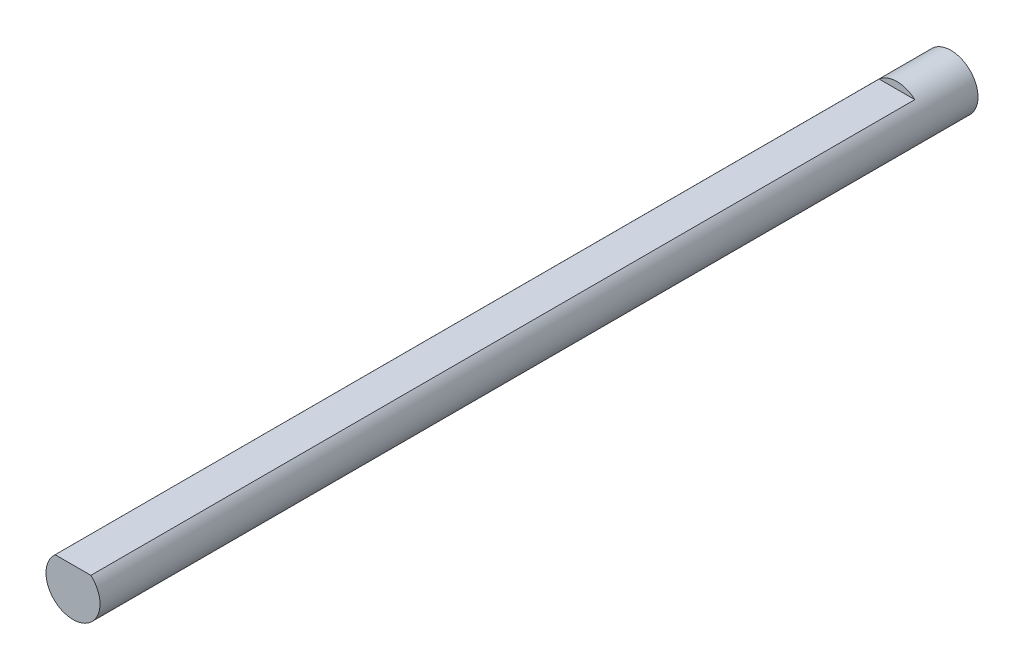
ISO-10303-21;
HEADER;
FILE_DESCRIPTION(('STEP AP214'),'2;1');
FILE_NAME('part.step','',(''),(''),'','','');
FILE_SCHEMA(('AUTOMOTIVE_DESIGN { 1 0 10303 214 1 1 1 1 }'));
ENDSEC;
DATA;
#1=APPLICATION_CONTEXT('core data for automotive mechanical design processes');
#2=APPLICATION_PROTOCOL_DEFINITION('international standard','automotive_design',2000,#1);
#3=PRODUCT_CONTEXT('',#1,'mechanical');
#4=PRODUCT('Part','Part','',(#3));
#5=PRODUCT_RELATED_PRODUCT_CATEGORY('part','',(#4));
#6=PRODUCT_DEFINITION_FORMATION('','',#4);
#7=PRODUCT_DEFINITION_CONTEXT('part definition',#1,'design');
#8=PRODUCT_DEFINITION('design','',#6,#7);
#9=PRODUCT_DEFINITION_SHAPE('','',#8);
#10=(LENGTH_UNIT() NAMED_UNIT(*) SI_UNIT(.MILLI.,.METRE.));
#11=(NAMED_UNIT(*) PLANE_ANGLE_UNIT() SI_UNIT($,.RADIAN.));
#12=(NAMED_UNIT(*) SI_UNIT($,.STERADIAN.) SOLID_ANGLE_UNIT());
#13=UNCERTAINTY_MEASURE_WITH_UNIT(LENGTH_MEASURE(1.E-05),#10,'distance_accuracy_value','');
#14=(GEOMETRIC_REPRESENTATION_CONTEXT(3) GLOBAL_UNCERTAINTY_ASSIGNED_CONTEXT((#13)) GLOBAL_UNIT_ASSIGNED_CONTEXT((#10,
#11,#12)) REPRESENTATION_CONTEXT('',''));
#15=CARTESIAN_POINT('',(0.,0.,0.));
#16=DIRECTION('',(0.,0.,1.));
#17=DIRECTION('',(1.,0.,0.));
#18=AXIS2_PLACEMENT_3D('',#15,#16,#17);
#19=CARTESIAN_POINT('',(0.,0.,-65.));
#20=DIRECTION('',(0.,0.,1.));
#21=DIRECTION('',(1.,0.,0.));
#22=AXIS2_PLACEMENT_3D('',#19,#20,#21);
#23=CYLINDRICAL_SURFACE('',#22,4.);
#24=DIRECTION('',(0.,0.,1.));
#25=VECTOR('',#24,1.);
#26=CARTESIAN_POINT('',(2.64575131106459,3.,-57.));
#27=LINE('',#26,#25);
#28=CARTESIAN_POINT('',(2.64575131106459,3.,-57.));
#29=VERTEX_POINT('',#28);
#30=CARTESIAN_POINT('',(2.64575131106459,3.,65.));
#31=VERTEX_POINT('',#30);
#32=EDGE_CURVE('E53',#29,#31,#27,.T.);
#33=ORIENTED_EDGE('',*,*,#32,.T.);
#34=CARTESIAN_POINT('',(0.,0.,65.));
#35=DIRECTION('',(0.,0.,1.));
#36=DIRECTION('',(1.,0.,0.));
#37=AXIS2_PLACEMENT_3D('',#34,#35,#36);
#38=CIRCLE('',#37,4.);
#39=CARTESIAN_POINT('',(-2.64575131106459,3.,65.));
#40=VERTEX_POINT('',#39);
#41=EDGE_CURVE('E40',#40,#31,#38,.T.);
#42=ORIENTED_EDGE('',*,*,#41,.F.);
#43=DIRECTION('',(0.,0.,1.));
#44=VECTOR('',#43,1.);
#45=CARTESIAN_POINT('',(-2.64575131106459,3.,-57.));
#46=LINE('',#45,#44);
#47=CARTESIAN_POINT('',(-2.64575131106459,3.,-57.));
#48=VERTEX_POINT('',#47);
#49=EDGE_CURVE('E47',#48,#40,#46,.T.);
#50=ORIENTED_EDGE('',*,*,#49,.F.);
#51=CARTESIAN_POINT('',(0.,0.,-57.));
#52=DIRECTION('',(0.,0.,1.));
#53=DIRECTION('',(-1.,0.,0.));
#54=AXIS2_PLACEMENT_3D('',#51,#52,#53);
#55=CIRCLE('',#54,4.00000000000001);
#56=EDGE_CURVE('E63',#29,#48,#55,.T.);
#57=ORIENTED_EDGE('',*,*,#56,.F.);
#58=EDGE_LOOP('',(#33,#42,#50,#57));
#59=FACE_BOUND('',#58,.T.);
#60=CARTESIAN_POINT('',(0.,0.,-65.));
#61=DIRECTION('',(0.,0.,1.));
#62=DIRECTION('',(1.,0.,0.));
#63=AXIS2_PLACEMENT_3D('',#60,#61,#62);
#64=CIRCLE('',#63,4.);
#65=CARTESIAN_POINT('',(4.,0.,-65.));
#66=VERTEX_POINT('',#65);
#67=EDGE_CURVE('E11',#66,#66,#64,.T.);
#68=ORIENTED_EDGE('',*,*,#67,.T.);
#69=EDGE_LOOP('',(#68));
#70=FACE_BOUND('',#69,.T.);
#71=ADVANCED_FACE('F33',(#59,#70),#23,.T.);
#72=CARTESIAN_POINT('',(0.,0.,-65.));
#73=DIRECTION('',(0.,0.,1.));
#74=DIRECTION('',(1.,0.,0.));
#75=AXIS2_PLACEMENT_3D('',#72,#73,#74);
#76=PLANE('',#75);
#77=ORIENTED_EDGE('',*,*,#67,.F.);
#78=EDGE_LOOP('',(#77));
#79=FACE_BOUND('',#78,.T.);
#80=ADVANCED_FACE('F83',(#79),#76,.F.);
#81=CARTESIAN_POINT('',(0.,0.,65.));
#82=DIRECTION('',(0.,0.,1.));
#83=DIRECTION('',(1.,0.,0.));
#84=AXIS2_PLACEMENT_3D('',#81,#82,#83);
#85=PLANE('',#84);
#86=DIRECTION('',(1.,0.,0.));
#87=VECTOR('',#86,1.);
#88=CARTESIAN_POINT('',(-2.64575131106459,3.,65.));
#89=LINE('',#88,#87);
#90=EDGE_CURVE('E58',#40,#31,#89,.T.);
#91=ORIENTED_EDGE('',*,*,#90,.F.);
#92=ORIENTED_EDGE('',*,*,#41,.T.);
#93=EDGE_LOOP('',(#91,#92));
#94=FACE_BOUND('',#93,.T.);
#95=ADVANCED_FACE('F69',(#94),#85,.T.);
#96=CARTESIAN_POINT('',(-2.64575131106459,3.,-57.));
#97=DIRECTION('',(0.,-1.,0.));
#98=DIRECTION('',(0.,0.,-1.));
#99=AXIS2_PLACEMENT_3D('',#96,#97,#98);
#100=PLANE('',#99);
#101=ORIENTED_EDGE('',*,*,#90,.T.);
#102=ORIENTED_EDGE('',*,*,#32,.F.);
#103=DIRECTION('',(1.,0.,0.));
#104=VECTOR('',#103,1.);
#105=CARTESIAN_POINT('',(-2.64575131106459,3.,-57.));
#106=LINE('',#105,#104);
#107=EDGE_CURVE('E71',#48,#29,#106,.T.);
#108=ORIENTED_EDGE('',*,*,#107,.F.);
#109=ORIENTED_EDGE('',*,*,#49,.T.);
#110=EDGE_LOOP('',(#101,#102,#108,#109));
#111=FACE_BOUND('',#110,.T.);
#112=ADVANCED_FACE('F59',(#111),#100,.F.);
#113=CARTESIAN_POINT('',(0.,0.,-57.));
#114=DIRECTION('',(0.,0.,-1.));
#115=DIRECTION('',(-1.,0.,0.));
#116=AXIS2_PLACEMENT_3D('',#113,#114,#115);
#117=PLANE('',#116);
#118=ORIENTED_EDGE('',*,*,#56,.T.);
#119=ORIENTED_EDGE('',*,*,#107,.T.);
#120=EDGE_LOOP('',(#118,#119));
#121=FACE_BOUND('',#120,.T.);
#122=ADVANCED_FACE('F75',(#121),#117,.F.);
#123=CLOSED_SHELL('',(#71,#80,#95,#112,#122));
#124=MANIFOLD_SOLID_BREP('B2',#123);
#125=ADVANCED_BREP_SHAPE_REPRESENTATION('',(#18,#124),#14);
#126=SHAPE_DEFINITION_REPRESENTATION(#9,#125);
ENDSEC;
END-ISO-10303-21;
